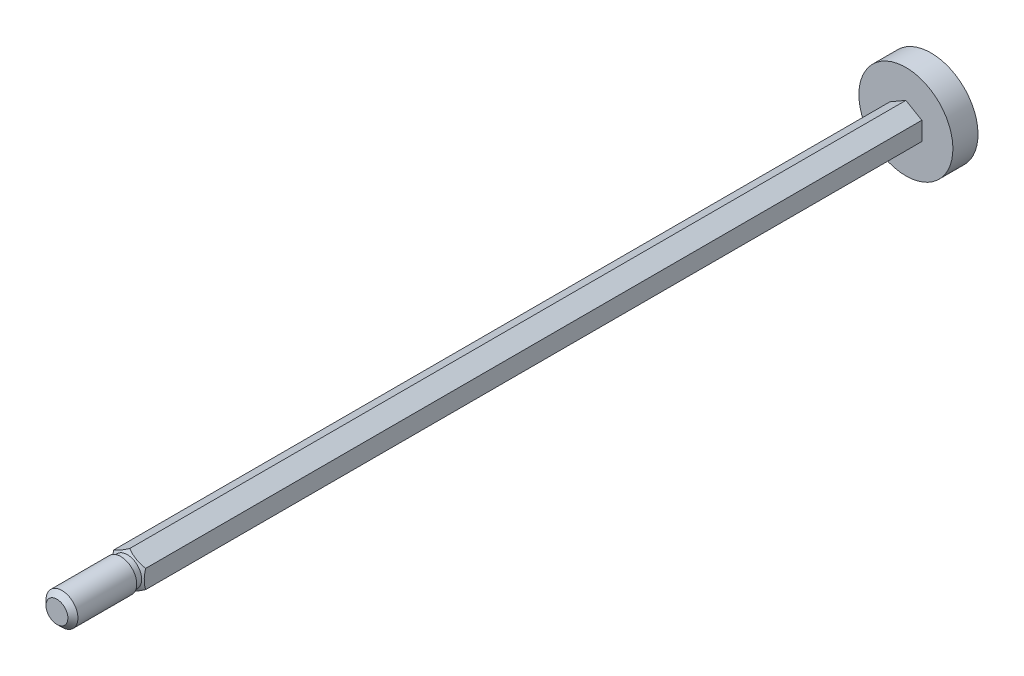
ISO-10303-21;
HEADER;
FILE_DESCRIPTION(('STEP AP214'),'2;1');
FILE_NAME('part.step','',(''),(''),'','','');
FILE_SCHEMA(('AUTOMOTIVE_DESIGN { 1 0 10303 214 1 1 1 1 }'));
ENDSEC;
DATA;
#1=APPLICATION_CONTEXT('core data for automotive mechanical design processes');
#2=APPLICATION_PROTOCOL_DEFINITION('international standard','automotive_design',2000,#1);
#3=PRODUCT_CONTEXT('',#1,'mechanical');
#4=PRODUCT('Part','Part','',(#3));
#5=PRODUCT_RELATED_PRODUCT_CATEGORY('part','',(#4));
#6=PRODUCT_DEFINITION_FORMATION('','',#4);
#7=PRODUCT_DEFINITION_CONTEXT('part definition',#1,'design');
#8=PRODUCT_DEFINITION('design','',#6,#7);
#9=PRODUCT_DEFINITION_SHAPE('','',#8);
#10=(LENGTH_UNIT() NAMED_UNIT(*) SI_UNIT(.MILLI.,.METRE.));
#11=(NAMED_UNIT(*) PLANE_ANGLE_UNIT() SI_UNIT($,.RADIAN.));
#12=(NAMED_UNIT(*) SI_UNIT($,.STERADIAN.) SOLID_ANGLE_UNIT());
#13=UNCERTAINTY_MEASURE_WITH_UNIT(LENGTH_MEASURE(1.E-05),#10,'distance_accuracy_value','');
#14=(GEOMETRIC_REPRESENTATION_CONTEXT(3) GLOBAL_UNCERTAINTY_ASSIGNED_CONTEXT((#13)) GLOBAL_UNIT_ASSIGNED_CONTEXT((#10,
#11,#12)) REPRESENTATION_CONTEXT('',''));
#15=CARTESIAN_POINT('',(0.,0.,0.));
#16=DIRECTION('',(0.,0.,1.));
#17=DIRECTION('',(1.,0.,0.));
#18=AXIS2_PLACEMENT_3D('',#15,#16,#17);
#19=CARTESIAN_POINT('',(3.175,-1.83308710467706,130.26888522099));
#20=DIRECTION('',(-1.,0.,0.));
#21=DIRECTION('',(0.,1.,0.));
#22=AXIS2_PLACEMENT_3D('',#19,#20,#21);
#23=PLANE('',#22);
#24=DIRECTION('',(0.,0.,-1.));
#25=VECTOR('',#24,1.);
#26=CARTESIAN_POINT('',(3.175,1.83308710467706,130.26888522099));
#27=LINE('',#26,#25);
#28=CARTESIAN_POINT('',(3.175,1.83308710467706,106.097881600524));
#29=VERTEX_POINT('',#28);
#30=CARTESIAN_POINT('',(3.175,1.83308710467706,-48.3));
#31=VERTEX_POINT('',#30);
#32=EDGE_CURVE('E305',#29,#31,#27,.T.);
#33=ORIENTED_EDGE('',*,*,#32,.F.);
#34=CARTESIAN_POINT('',(3.175,1.83308710467707,106.097881600524));
#35=CARTESIAN_POINT('',(3.175,1.35912776082604,106.234701877903));
#36=CARTESIAN_POINT('',(3.175,0.930839226629455,106.30430511811));
#37=CARTESIAN_POINT('',(3.175,0.45671909994101,106.38135667198));
#38=CARTESIAN_POINT('',(3.175,0.000694572241684895,106.38146111865));
#39=CARTESIAN_POINT('',(3.175,-0.45139134395829,106.381564663231));
#40=CARTESIAN_POINT('',(3.175,-0.923314703707666,106.305522770409));
#41=CARTESIAN_POINT('',(3.175,-1.35444291743926,106.236054275698));
#42=CARTESIAN_POINT('',(3.175,-1.83308710467706,106.097881600524));
#43=B_SPLINE_CURVE_WITH_KNOTS('',2,(#34,#35,#36,#37,#38,#39,#40,#41,#42),.UNSPECIFIED.,.F.,.F.,
(3,2,2,2,3),(0.,0.25,0.5,0.75,1.),.UNSPECIFIED.);
#44=CARTESIAN_POINT('',(3.175,-1.83308710467706,106.097881600524));
#45=VERTEX_POINT('',#44);
#46=EDGE_CURVE('E264',#29,#45,#43,.T.);
#47=ORIENTED_EDGE('',*,*,#46,.T.);
#48=DIRECTION('',(0.,0.,-1.));
#49=VECTOR('',#48,1.);
#50=CARTESIAN_POINT('',(3.175,-1.83308710467706,130.26888522099));
#51=LINE('',#50,#49);
#52=CARTESIAN_POINT('',(3.175,-1.83308710467706,-48.3));
#53=VERTEX_POINT('',#52);
#54=EDGE_CURVE('E11',#45,#53,#51,.T.);
#55=ORIENTED_EDGE('',*,*,#54,.T.);
#56=DIRECTION('',(0.,-1.,0.));
#57=VECTOR('',#56,1.);
#58=CARTESIAN_POINT('',(3.175,0.,-48.3));
#59=LINE('',#58,#57);
#60=EDGE_CURVE('E160',#31,#53,#59,.T.);
#61=ORIENTED_EDGE('',*,*,#60,.F.);
#62=EDGE_LOOP('',(#33,#47,#55,#61));
#63=FACE_BOUND('',#62,.T.);
#64=ADVANCED_FACE('F17',(#63),#23,.F.);
#65=CARTESIAN_POINT('',(0.,-3.66617420935412,130.26888522099));
#66=DIRECTION('',(-0.5,0.866025403784438,0.));
#67=DIRECTION('',(0.,0.,-1.));
#68=AXIS2_PLACEMENT_3D('',#65,#66,#67);
#69=PLANE('',#68);
#70=ORIENTED_EDGE('',*,*,#54,.F.);
#71=CARTESIAN_POINT('',(3.17499999999999,-1.83308710467707,106.097881600524));
#72=CARTESIAN_POINT('',(2.32614702191682,-2.3231726000758,106.38083259322));
#73=CARTESIAN_POINT('',(1.5905314517561,-2.74788044752817,106.381460048461));
#74=CARTESIAN_POINT('',(1.19697686939994,-2.97509929159231,106.38179573723));
#75=CARTESIAN_POINT('',(0.786085562009002,-3.21232749852215,106.305187251164));
#76=CARTESIAN_POINT('',(0.413539026408947,-3.4274173411365,106.235727942661));
#77=CARTESIAN_POINT('',(0.,-3.66617420935413,106.097881600524));
#78=B_SPLINE_CURVE_WITH_KNOTS('',2,(#71,#72,#73,#74,#75,#76,#77),.UNSPECIFIED.,.F.,.F.,(3,2,2,
3),(0.,0.5,0.75,1.),.UNSPECIFIED.);
#79=CARTESIAN_POINT('',(0.,-3.66617420935412,106.097881600524));
#80=VERTEX_POINT('',#79);
#81=EDGE_CURVE('E257',#45,#80,#78,.T.);
#82=ORIENTED_EDGE('',*,*,#81,.T.);
#83=DIRECTION('',(0.,0.,-1.));
#84=VECTOR('',#83,1.);
#85=CARTESIAN_POINT('',(0.,-3.66617420935412,130.26888522099));
#86=LINE('',#85,#84);
#87=CARTESIAN_POINT('',(0.,-3.66617420935412,-48.3));
#88=VERTEX_POINT('',#87);
#89=EDGE_CURVE('E30',#80,#88,#86,.T.);
#90=ORIENTED_EDGE('',*,*,#89,.T.);
#91=DIRECTION('',(-0.866025403784438,-0.5,0.));
#92=VECTOR('',#91,1.);
#93=CARTESIAN_POINT('',(1.5875,-2.74963065701559,-48.3));
#94=LINE('',#93,#92);
#95=EDGE_CURVE('E156',#53,#88,#94,.T.);
#96=ORIENTED_EDGE('',*,*,#95,.F.);
#97=EDGE_LOOP('',(#70,#82,#90,#96));
#98=FACE_BOUND('',#97,.T.);
#99=ADVANCED_FACE('F333',(#98),#69,.F.);
#100=CARTESIAN_POINT('',(-3.175,-1.83308710467706,130.26888522099));
#101=DIRECTION('',(0.5,0.866025403784439,0.));
#102=DIRECTION('',(0.,0.,-1.));
#103=AXIS2_PLACEMENT_3D('',#100,#101,#102);
#104=PLANE('',#103);
#105=ORIENTED_EDGE('',*,*,#89,.F.);
#106=CARTESIAN_POINT('',(0.,-3.66617420935413,106.097881600524));
#107=CARTESIAN_POINT('',(-0.848852977984556,-3.17608871401233,106.380832593187));
#108=CARTESIAN_POINT('',(-1.58446854824383,-2.75138086650305,106.381460048461));
#109=CARTESIAN_POINT('',(-1.97802313053457,-2.52416202247668,106.381795737248));
#110=CARTESIAN_POINT('',(-2.3889144379909,-2.2869338155091,106.305187251165));
#111=CARTESIAN_POINT('',(-2.76146097362252,-2.07184397287652,106.235727942651));
#112=CARTESIAN_POINT('',(-3.17499999999989,-1.83308710467713,106.097881600524));
#113=B_SPLINE_CURVE_WITH_KNOTS('',2,(#106,#107,#108,#109,#110,#111,#112),.UNSPECIFIED.,.F.,.F.,
(3,2,2,3),(0.,0.5,0.75,1.),.UNSPECIFIED.);
#114=CARTESIAN_POINT('',(-3.175,-1.83308710467731,106.097881600524));
#115=VERTEX_POINT('',#114);
#116=EDGE_CURVE('E246',#80,#115,#113,.T.);
#117=ORIENTED_EDGE('',*,*,#116,.T.);
#118=DIRECTION('',(0.,0.,-1.));
#119=VECTOR('',#118,1.);
#120=CARTESIAN_POINT('',(-3.175,-1.83308710467706,130.26888522099));
#121=LINE('',#120,#119);
#122=CARTESIAN_POINT('',(-3.175,-1.83308710467706,-48.3));
#123=VERTEX_POINT('',#122);
#124=EDGE_CURVE('E239',#115,#123,#121,.T.);
#125=ORIENTED_EDGE('',*,*,#124,.T.);
#126=DIRECTION('',(-0.866025403784439,0.5,0.));
#127=VECTOR('',#126,1.);
#128=CARTESIAN_POINT('',(-1.5875,-2.7496306570156,-48.3));
#129=LINE('',#128,#127);
#130=EDGE_CURVE('E159',#88,#123,#129,.T.);
#131=ORIENTED_EDGE('',*,*,#130,.F.);
#132=EDGE_LOOP('',(#105,#117,#125,#131));
#133=FACE_BOUND('',#132,.T.);
#134=ADVANCED_FACE('F185',(#133),#104,.F.);
#135=CARTESIAN_POINT('',(-3.175,1.83308710467706,130.26888522099));
#136=DIRECTION('',(1.,0.,0.));
#137=DIRECTION('',(0.,0.,-1.));
#138=AXIS2_PLACEMENT_3D('',#135,#136,#137);
#139=PLANE('',#138);
#140=ORIENTED_EDGE('',*,*,#124,.F.);
#141=CARTESIAN_POINT('',(-3.175,-1.83308710467731,106.097881600524));
#142=CARTESIAN_POINT('',(-3.175,-1.35503327528653,106.235883854067));
#143=CARTESIAN_POINT('',(-3.175,-0.923314703707805,106.305522770409));
#144=CARTESIAN_POINT('',(-3.175,-0.45246980527661,106.381473008946));
#145=CARTESIAN_POINT('',(-3.175,0.000694572241594906,106.38146111865));
#146=CARTESIAN_POINT('',(-3.175,0.45563804176656,106.381449181674));
#147=CARTESIAN_POINT('',(-3.175,0.930839226629402,106.30430511811));
#148=CARTESIAN_POINT('',(-3.175,1.35853436551841,106.234873176373));
#149=CARTESIAN_POINT('',(-3.175,1.83308710467706,106.097881600524));
#150=B_SPLINE_CURVE_WITH_KNOTS('',2,(#141,#142,#143,#144,#145,#146,#147,#148,#149),
.UNSPECIFIED.,.F.,.F.,(3,2,2,2,3),(0.,0.25,0.5,0.75,1.),.UNSPECIFIED.);
#151=CARTESIAN_POINT('',(-3.175,1.83308710467706,106.097881600524));
#152=VERTEX_POINT('',#151);
#153=EDGE_CURVE('E152',#115,#152,#150,.T.);
#154=ORIENTED_EDGE('',*,*,#153,.T.);
#155=DIRECTION('',(0.,0.,-1.));
#156=VECTOR('',#155,1.);
#157=CARTESIAN_POINT('',(-3.175,1.83308710467706,130.26888522099));
#158=LINE('',#157,#156);
#159=CARTESIAN_POINT('',(-3.175,1.83308710467706,-48.3));
#160=VERTEX_POINT('',#159);
#161=EDGE_CURVE('E45',#152,#160,#158,.T.);
#162=ORIENTED_EDGE('',*,*,#161,.T.);
#163=DIRECTION('',(0.,1.,0.));
#164=VECTOR('',#163,1.);
#165=CARTESIAN_POINT('',(-3.175,0.,-48.3));
#166=LINE('',#165,#164);
#167=EDGE_CURVE('E275',#123,#160,#166,.T.);
#168=ORIENTED_EDGE('',*,*,#167,.F.);
#169=EDGE_LOOP('',(#140,#154,#162,#168));
#170=FACE_BOUND('',#169,.T.);
#171=ADVANCED_FACE('F174',(#170),#139,.F.);
#172=CARTESIAN_POINT('',(0.,3.66617420935412,130.26888522099));
#173=DIRECTION('',(0.5,-0.866025403784438,0.));
#174=DIRECTION('',(-0.866025403784438,-0.5,0.));
#175=AXIS2_PLACEMENT_3D('',#172,#173,#174);
#176=PLANE('',#175);
#177=ORIENTED_EDGE('',*,*,#161,.F.);
#178=CARTESIAN_POINT('',(-3.175,1.83308710467706,106.097881600524));
#179=CARTESIAN_POINT('',(-2.32614702198216,2.32317260003807,106.380832593198));
#180=CARTESIAN_POINT('',(-1.5905314517561,2.74788044752817,106.381460048461));
#181=CARTESIAN_POINT('',(-1.19697686938537,2.97509929160073,106.381795737242));
#182=CARTESIAN_POINT('',(-0.786085562009002,3.21232749852215,106.305187251164));
#183=CARTESIAN_POINT('',(-0.413539026319681,3.42741734118804,106.235727942631));
#184=CARTESIAN_POINT('',(0.,3.66617420935413,106.097881600524));
#185=B_SPLINE_CURVE_WITH_KNOTS('',2,(#178,#179,#180,#181,#182,#183,#184),.UNSPECIFIED.,.F.,.F.,
(3,2,2,3),(0.,0.5,0.75,1.),.UNSPECIFIED.);
#186=CARTESIAN_POINT('',(0.,3.66617420935412,106.097881600524));
#187=VERTEX_POINT('',#186);
#188=EDGE_CURVE('E313',#152,#187,#185,.T.);
#189=ORIENTED_EDGE('',*,*,#188,.T.);
#190=DIRECTION('',(0.,0.,-1.));
#191=VECTOR('',#190,1.);
#192=CARTESIAN_POINT('',(0.,3.66617420935412,130.26888522099));
#193=LINE('',#192,#191);
#194=CARTESIAN_POINT('',(0.,3.66617420935412,-48.3));
#195=VERTEX_POINT('',#194);
#196=EDGE_CURVE('E93',#187,#195,#193,.T.);
#197=ORIENTED_EDGE('',*,*,#196,.T.);
#198=DIRECTION('',(0.866025403784438,0.5,0.));
#199=VECTOR('',#198,1.);
#200=CARTESIAN_POINT('',(-1.5875,2.74963065701559,-48.3));
#201=LINE('',#200,#199);
#202=EDGE_CURVE('E279',#160,#195,#201,.T.);
#203=ORIENTED_EDGE('',*,*,#202,.F.);
#204=EDGE_LOOP('',(#177,#189,#197,#203));
#205=FACE_BOUND('',#204,.T.);
#206=ADVANCED_FACE('F184',(#205),#176,.F.);
#207=CARTESIAN_POINT('',(3.175,1.83308710467706,130.26888522099));
#208=DIRECTION('',(-0.5,-0.866025403784439,0.));
#209=DIRECTION('',(0.,0.,1.));
#210=AXIS2_PLACEMENT_3D('',#207,#208,#209);
#211=PLANE('',#210);
#212=ORIENTED_EDGE('',*,*,#196,.F.);
#213=CARTESIAN_POINT('',(0.,3.66617420935412,106.097881600524));
#214=CARTESIAN_POINT('',(0.848852978017785,3.17608871399314,106.380832593198));
#215=CARTESIAN_POINT('',(1.5844685482439,2.75138086650302,106.381460048461));
#216=CARTESIAN_POINT('',(1.97802313058405,2.52416202244812,106.381795737242));
#217=CARTESIAN_POINT('',(2.388914437991,2.28693381550904,106.305187251164));
#218=CARTESIAN_POINT('',(2.76146097364434,2.07184397286392,106.235727942643));
#219=CARTESIAN_POINT('',(3.175,1.83308710467706,106.097881600524));
#220=B_SPLINE_CURVE_WITH_KNOTS('',2,(#213,#214,#215,#216,#217,#218,#219),.UNSPECIFIED.,.F.,.F.,
(3,2,2,3),(0.,0.5,0.75,1.),.UNSPECIFIED.);
#221=EDGE_CURVE('E356',#187,#29,#220,.T.);
#222=ORIENTED_EDGE('',*,*,#221,.T.);
#223=ORIENTED_EDGE('',*,*,#32,.T.);
#224=DIRECTION('',(0.866025403784439,-0.5,0.));
#225=VECTOR('',#224,1.);
#226=CARTESIAN_POINT('',(1.5875,2.7496306570156,-48.3));
#227=LINE('',#226,#225);
#228=EDGE_CURVE('E283',#195,#31,#227,.T.);
#229=ORIENTED_EDGE('',*,*,#228,.F.);
#230=EDGE_LOOP('',(#212,#222,#223,#229));
#231=FACE_BOUND('',#230,.T.);
#232=ADVANCED_FACE('F324',(#231),#211,.F.);
#233=CARTESIAN_POINT('',(0.,0.,-48.3));
#234=DIRECTION('',(0.,0.,1.));
#235=DIRECTION('',(0.,1.,0.));
#236=AXIS2_PLACEMENT_3D('',#233,#234,#235);
#237=PLANE('',#236);
#238=ORIENTED_EDGE('',*,*,#228,.T.);
#239=ORIENTED_EDGE('',*,*,#60,.T.);
#240=ORIENTED_EDGE('',*,*,#95,.T.);
#241=ORIENTED_EDGE('',*,*,#130,.T.);
#242=ORIENTED_EDGE('',*,*,#167,.T.);
#243=ORIENTED_EDGE('',*,*,#202,.T.);
#244=EDGE_LOOP('',(#238,#239,#240,#241,#242,#243));
#245=FACE_BOUND('',#244,.T.);
#246=CARTESIAN_POINT('',(0.,0.,-48.3));
#247=DIRECTION('',(0.,0.,1.));
#248=DIRECTION('',(0.,1.,0.));
#249=AXIS2_PLACEMENT_3D('',#246,#247,#248);
#250=CIRCLE('',#249,9.35);
#251=CARTESIAN_POINT('',(0.,-9.35,-48.3));
#252=VERTEX_POINT('',#251);
#253=EDGE_CURVE('E161',#252,#252,#250,.T.);
#254=ORIENTED_EDGE('',*,*,#253,.T.);
#255=EDGE_LOOP('',(#254));
#256=FACE_BOUND('',#255,.T.);
#257=ADVANCED_FACE('F299',(#245,#256),#237,.T.);
#258=CARTESIAN_POINT('',(0.,0.,-53.3));
#259=DIRECTION('',(0.,0.,1.));
#260=DIRECTION('',(0.,1.,0.));
#261=AXIS2_PLACEMENT_3D('',#258,#259,#260);
#262=PLANE('',#261);
#263=CARTESIAN_POINT('',(0.,0.,-53.3));
#264=DIRECTION('',(0.,0.,1.));
#265=DIRECTION('',(0.,1.,0.));
#266=AXIS2_PLACEMENT_3D('',#263,#264,#265);
#267=CIRCLE('',#266,9.35);
#268=CARTESIAN_POINT('',(0.,-9.35,-53.3));
#269=VERTEX_POINT('',#268);
#270=EDGE_CURVE('E165',#269,#269,#267,.T.);
#271=ORIENTED_EDGE('',*,*,#270,.F.);
#272=EDGE_LOOP('',(#271));
#273=FACE_BOUND('',#272,.T.);
#274=ADVANCED_FACE('F19',(#273),#262,.F.);
#275=CARTESIAN_POINT('',(0.,0.,120.5691));
#276=DIRECTION('',(0.,0.,-1.));
#277=DIRECTION('',(1.,0.,0.));
#278=AXIS2_PLACEMENT_3D('',#275,#276,#277);
#279=PLANE('',#278);
#280=CARTESIAN_POINT('',(0.,0.,120.5691));
#281=DIRECTION('',(0.,0.,1.));
#282=DIRECTION('',(0.,-1.,0.));
#283=AXIS2_PLACEMENT_3D('',#280,#281,#282);
#284=CIRCLE('',#283,2.175);
#285=CARTESIAN_POINT('',(0.,-2.175,120.5691));
#286=VERTEX_POINT('',#285);
#287=EDGE_CURVE('E143',#286,#286,#284,.T.);
#288=ORIENTED_EDGE('',*,*,#287,.T.);
#289=EDGE_LOOP('',(#288));
#290=FACE_BOUND('',#289,.T.);
#291=ADVANCED_FACE('F188',(#290),#279,.F.);
#292=CARTESIAN_POINT('',(5.39,0.,107.8691));
#293=DIRECTION('',(0.,0.,1.));
#294=DIRECTION('',(0.,1.,0.));
#295=AXIS2_PLACEMENT_3D('',#292,#293,#294);
#296=PLANE('',#295);
#297=CARTESIAN_POINT('',(0.,0.,107.8691));
#298=DIRECTION('',(0.,0.,-1.));
#299=DIRECTION('',(0.,-1.,0.));
#300=AXIS2_PLACEMENT_3D('',#297,#298,#299);
#301=CIRCLE('',#300,2.85);
#302=CARTESIAN_POINT('',(0.,2.85,107.8691));
#303=VERTEX_POINT('',#302);
#304=EDGE_CURVE('E104',#303,#303,#301,.T.);
#305=ORIENTED_EDGE('',*,*,#304,.F.);
#306=EDGE_LOOP('',(#305));
#307=FACE_BOUND('',#306,.T.);
#308=CARTESIAN_POINT('',(0.,0.,107.8691));
#309=DIRECTION('',(0.,0.,-1.));
#310=DIRECTION('',(0.,1.,0.));
#311=AXIS2_PLACEMENT_3D('',#308,#309,#310);
#312=CIRCLE('',#311,3.175);
#313=CARTESIAN_POINT('',(0.,3.175,107.8691));
#314=VERTEX_POINT('',#313);
#315=EDGE_CURVE('E131',#314,#314,#312,.T.);
#316=ORIENTED_EDGE('',*,*,#315,.T.);
#317=EDGE_LOOP('',(#316));
#318=FACE_BOUND('',#317,.T.);
#319=ADVANCED_FACE('F191',(#307,#318),#296,.F.);
#320=CARTESIAN_POINT('',(0.,0.,-3.5114662467373));
#321=DIRECTION('',(0.,0.,-1.));
#322=DIRECTION('',(0.,-1.,0.));
#323=AXIS2_PLACEMENT_3D('',#320,#321,#322);
#324=CYLINDRICAL_SURFACE('',#323,2.85);
#325=CARTESIAN_POINT('',(0.,0.,106.5691));
#326=DIRECTION('',(0.,0.,-1.));
#327=DIRECTION('',(0.,-1.,0.));
#328=AXIS2_PLACEMENT_3D('',#325,#326,#327);
#329=CIRCLE('',#328,2.85);
#330=CARTESIAN_POINT('',(0.,2.85,106.5691));
#331=VERTEX_POINT('',#330);
#332=EDGE_CURVE('E259',#331,#331,#329,.T.);
#333=ORIENTED_EDGE('',*,*,#332,.F.);
#334=EDGE_LOOP('',(#333));
#335=FACE_BOUND('',#334,.T.);
#336=ORIENTED_EDGE('',*,*,#304,.T.);
#337=EDGE_LOOP('',(#336));
#338=FACE_BOUND('',#337,.T.);
#339=ADVANCED_FACE('F194',(#335,#338),#324,.T.);
#340=CARTESIAN_POINT('',(0.,0.,119.5691));
#341=DIRECTION('',(0.,0.,-1.));
#342=DIRECTION('',(0.,-1.,0.));
#343=AXIS2_PLACEMENT_3D('',#340,#341,#342);
#344=CONICAL_SURFACE('',#343,3.175,0.785398163397456);
#345=CARTESIAN_POINT('',(0.,0.,119.5691));
#346=DIRECTION('',(0.,0.,-1.));
#347=DIRECTION('',(0.,-1.,0.));
#348=AXIS2_PLACEMENT_3D('',#345,#346,#347);
#349=CIRCLE('',#348,3.175);
#350=CARTESIAN_POINT('',(0.,3.175,119.5691));
#351=VERTEX_POINT('',#350);
#352=EDGE_CURVE('E138',#351,#351,#349,.T.);
#353=ORIENTED_EDGE('',*,*,#352,.F.);
#354=EDGE_LOOP('',(#353));
#355=FACE_BOUND('',#354,.T.);
#356=ORIENTED_EDGE('',*,*,#287,.F.);
#357=EDGE_LOOP('',(#356));
#358=FACE_BOUND('',#357,.T.);
#359=ADVANCED_FACE('F326',(#355,#358),#344,.T.);
#360=CARTESIAN_POINT('',(0.,0.,106.5691));
#361=DIRECTION('',(0.,0.,1.));
#362=DIRECTION('',(0.,1.,0.));
#363=AXIS2_PLACEMENT_3D('',#360,#361,#362);
#364=CYLINDRICAL_SURFACE('',#363,3.175);
#365=ORIENTED_EDGE('',*,*,#352,.T.);
#366=EDGE_LOOP('',(#365));
#367=FACE_BOUND('',#366,.T.);
#368=ORIENTED_EDGE('',*,*,#315,.F.);
#369=EDGE_LOOP('',(#368));
#370=FACE_BOUND('',#369,.T.);
#371=ADVANCED_FACE('F139',(#367,#370),#364,.T.);
#372=CARTESIAN_POINT('',(0.,0.,106.5691));
#373=DIRECTION('',(0.,0.,-1.));
#374=DIRECTION('',(0.,-1.,0.));
#375=AXIS2_PLACEMENT_3D('',#372,#373,#374);
#376=CONICAL_SURFACE('',#375,2.85,1.0471975511966);
#377=ORIENTED_EDGE('',*,*,#116,.F.);
#378=ORIENTED_EDGE('',*,*,#81,.F.);
#379=ORIENTED_EDGE('',*,*,#46,.F.);
#380=ORIENTED_EDGE('',*,*,#221,.F.);
#381=ORIENTED_EDGE('',*,*,#188,.F.);
#382=ORIENTED_EDGE('',*,*,#153,.F.);
#383=EDGE_LOOP('',(#377,#378,#379,#380,#381,#382));
#384=FACE_BOUND('',#383,.T.);
#385=ORIENTED_EDGE('',*,*,#332,.T.);
#386=EDGE_LOOP('',(#385));
#387=FACE_BOUND('',#386,.T.);
#388=ADVANCED_FACE('F196',(#384,#387),#376,.T.);
#389=CARTESIAN_POINT('',(0.,0.,-48.3));
#390=DIRECTION('',(0.,0.,-1.));
#391=DIRECTION('',(0.,-1.,0.));
#392=AXIS2_PLACEMENT_3D('',#389,#390,#391);
#393=CYLINDRICAL_SURFACE('',#392,9.35);
#394=ORIENTED_EDGE('',*,*,#270,.T.);
#395=EDGE_LOOP('',(#394));
#396=FACE_BOUND('',#395,.T.);
#397=ORIENTED_EDGE('',*,*,#253,.F.);
#398=EDGE_LOOP('',(#397));
#399=FACE_BOUND('',#398,.T.);
#400=ADVANCED_FACE('F200',(#396,#399),#393,.T.);
#401=CLOSED_SHELL('',(#64,#99,#134,#171,#206,#232,#257,#274,#291,#319,#339,#359,#371,#388,#400));
#402=MANIFOLD_SOLID_BREP('B1',#401);
#403=ADVANCED_BREP_SHAPE_REPRESENTATION('',(#18,#402),#14);
#404=SHAPE_DEFINITION_REPRESENTATION(#9,#403);
ENDSEC;
END-ISO-10303-21;
